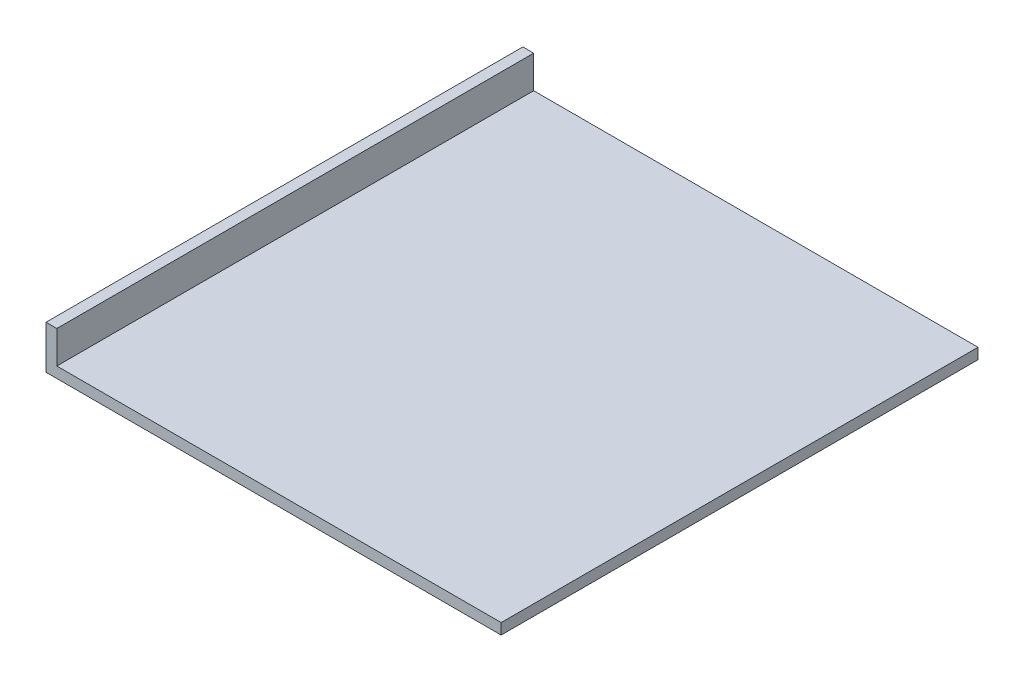
ISO-10303-21;
HEADER;
FILE_DESCRIPTION(('STEP AP214'),'2;1');
FILE_NAME('part.step','',(''),(''),'','','');
FILE_SCHEMA(('AUTOMOTIVE_DESIGN { 1 0 10303 214 1 1 1 1 }'));
ENDSEC;
DATA;
#1=APPLICATION_CONTEXT('core data for automotive mechanical design processes');
#2=APPLICATION_PROTOCOL_DEFINITION('international standard','automotive_design',2000,#1);
#3=PRODUCT_CONTEXT('',#1,'mechanical');
#4=PRODUCT('Part','Part','',(#3));
#5=PRODUCT_RELATED_PRODUCT_CATEGORY('part','',(#4));
#6=PRODUCT_DEFINITION_FORMATION('','',#4);
#7=PRODUCT_DEFINITION_CONTEXT('part definition',#1,'design');
#8=PRODUCT_DEFINITION('design','',#6,#7);
#9=PRODUCT_DEFINITION_SHAPE('','',#8);
#10=(LENGTH_UNIT() NAMED_UNIT(*) SI_UNIT(.MILLI.,.METRE.));
#11=(NAMED_UNIT(*) PLANE_ANGLE_UNIT() SI_UNIT($,.RADIAN.));
#12=(NAMED_UNIT(*) SI_UNIT($,.STERADIAN.) SOLID_ANGLE_UNIT());
#13=UNCERTAINTY_MEASURE_WITH_UNIT(LENGTH_MEASURE(1.E-05),#10,'distance_accuracy_value','');
#14=(GEOMETRIC_REPRESENTATION_CONTEXT(3) GLOBAL_UNCERTAINTY_ASSIGNED_CONTEXT((#13)) GLOBAL_UNIT_ASSIGNED_CONTEXT((#10,
#11,#12)) REPRESENTATION_CONTEXT('',''));
#15=CARTESIAN_POINT('',(0.,0.,0.));
#16=DIRECTION('',(0.,0.,1.));
#17=DIRECTION('',(1.,0.,0.));
#18=AXIS2_PLACEMENT_3D('',#15,#16,#17);
#19=CARTESIAN_POINT('',(0.,5.,0.));
#20=DIRECTION('',(0.,-1.,0.));
#21=DIRECTION('',(0.,0.,-1.));
#22=AXIS2_PLACEMENT_3D('',#19,#20,#21);
#23=PLANE('',#22);
#24=DIRECTION('',(0.,0.,-1.));
#25=VECTOR('',#24,1.);
#26=CARTESIAN_POINT('',(-100.,5.,-110.));
#27=LINE('',#26,#25);
#28=CARTESIAN_POINT('',(-100.,5.,110.));
#29=VERTEX_POINT('',#28);
#30=CARTESIAN_POINT('',(-100.,5.,-110.));
#31=VERTEX_POINT('',#30);
#32=EDGE_CURVE('E51',#29,#31,#27,.T.);
#33=ORIENTED_EDGE('',*,*,#32,.F.);
#34=DIRECTION('',(1.,0.,0.));
#35=VECTOR('',#34,1.);
#36=CARTESIAN_POINT('',(-105.,5.,110.));
#37=LINE('',#36,#35);
#38=CARTESIAN_POINT('',(105.,5.,110.));
#39=VERTEX_POINT('',#38);
#40=EDGE_CURVE('E56',#29,#39,#37,.T.);
#41=ORIENTED_EDGE('',*,*,#40,.T.);
#42=DIRECTION('',(0.,0.,-1.));
#43=VECTOR('',#42,1.);
#44=CARTESIAN_POINT('',(105.,5.,110.));
#45=LINE('',#44,#43);
#46=CARTESIAN_POINT('',(105.,5.,-110.));
#47=VERTEX_POINT('',#46);
#48=EDGE_CURVE('E87',#39,#47,#45,.T.);
#49=ORIENTED_EDGE('',*,*,#48,.T.);
#50=DIRECTION('',(-1.,0.,0.));
#51=VECTOR('',#50,1.);
#52=CARTESIAN_POINT('',(-105.,5.,-110.));
#53=LINE('',#52,#51);
#54=EDGE_CURVE('E137',#47,#31,#53,.T.);
#55=ORIENTED_EDGE('',*,*,#54,.T.);
#56=EDGE_LOOP('',(#33,#41,#49,#55));
#57=FACE_BOUND('',#56,.T.);
#58=ADVANCED_FACE('F36',(#57),#23,.F.);
#59=CARTESIAN_POINT('',(105.,5.,110.));
#60=DIRECTION('',(-1.,0.,0.));
#61=DIRECTION('',(0.,0.,1.));
#62=AXIS2_PLACEMENT_3D('',#59,#60,#61);
#63=PLANE('',#62);
#64=DIRECTION('',(0.,0.,-1.));
#65=VECTOR('',#64,1.);
#66=CARTESIAN_POINT('',(105.,0.,110.));
#67=LINE('',#66,#65);
#68=CARTESIAN_POINT('',(105.,0.,110.));
#69=VERTEX_POINT('',#68);
#70=CARTESIAN_POINT('',(105.,0.,-110.));
#71=VERTEX_POINT('',#70);
#72=EDGE_CURVE('E93',#69,#71,#67,.T.);
#73=ORIENTED_EDGE('',*,*,#72,.T.);
#74=DIRECTION('',(0.,-1.,0.));
#75=VECTOR('',#74,1.);
#76=CARTESIAN_POINT('',(105.,5.,-110.));
#77=LINE('',#76,#75);
#78=EDGE_CURVE('E11',#47,#71,#77,.T.);
#79=ORIENTED_EDGE('',*,*,#78,.F.);
#80=ORIENTED_EDGE('',*,*,#48,.F.);
#81=DIRECTION('',(0.,-1.,0.));
#82=VECTOR('',#81,1.);
#83=CARTESIAN_POINT('',(105.,5.,110.));
#84=LINE('',#83,#82);
#85=EDGE_CURVE('E79',#39,#69,#84,.T.);
#86=ORIENTED_EDGE('',*,*,#85,.T.);
#87=EDGE_LOOP('',(#73,#79,#80,#86));
#88=FACE_BOUND('',#87,.T.);
#89=ADVANCED_FACE('F38',(#88),#63,.F.);
#90=CARTESIAN_POINT('',(-105.,5.,-110.));
#91=DIRECTION('',(0.,0.,1.));
#92=DIRECTION('',(1.,0.,0.));
#93=AXIS2_PLACEMENT_3D('',#90,#91,#92);
#94=PLANE('',#93);
#95=DIRECTION('',(-1.,0.,0.));
#96=VECTOR('',#95,1.);
#97=CARTESIAN_POINT('',(-105.,0.,-110.));
#98=LINE('',#97,#96);
#99=CARTESIAN_POINT('',(-105.,0.,-110.));
#100=VERTEX_POINT('',#99);
#101=EDGE_CURVE('E96',#71,#100,#98,.T.);
#102=ORIENTED_EDGE('',*,*,#101,.T.);
#103=DIRECTION('',(0.,-1.,0.));
#104=VECTOR('',#103,1.);
#105=CARTESIAN_POINT('',(-105.,5.,-110.));
#106=LINE('',#105,#104);
#107=CARTESIAN_POINT('',(-105.,20.,-110.));
#108=VERTEX_POINT('',#107);
#109=EDGE_CURVE('E44',#108,#100,#106,.T.);
#110=ORIENTED_EDGE('',*,*,#109,.F.);
#111=DIRECTION('',(-1.,0.,0.));
#112=VECTOR('',#111,1.);
#113=CARTESIAN_POINT('',(-105.,20.,-110.));
#114=LINE('',#113,#112);
#115=CARTESIAN_POINT('',(-100.,20.,-110.));
#116=VERTEX_POINT('',#115);
#117=EDGE_CURVE('E120',#116,#108,#114,.T.);
#118=ORIENTED_EDGE('',*,*,#117,.F.);
#119=DIRECTION('',(0.,-1.,0.));
#120=VECTOR('',#119,1.);
#121=CARTESIAN_POINT('',(-100.,20.,-110.));
#122=LINE('',#121,#120);
#123=EDGE_CURVE('E101',#116,#31,#122,.T.);
#124=ORIENTED_EDGE('',*,*,#123,.T.);
#125=ORIENTED_EDGE('',*,*,#54,.F.);
#126=ORIENTED_EDGE('',*,*,#78,.T.);
#127=EDGE_LOOP('',(#102,#110,#118,#124,#125,#126));
#128=FACE_BOUND('',#127,.T.);
#129=ADVANCED_FACE('F117',(#128),#94,.F.);
#130=CARTESIAN_POINT('',(-105.,5.,110.));
#131=DIRECTION('',(1.,0.,0.));
#132=DIRECTION('',(0.,0.,-1.));
#133=AXIS2_PLACEMENT_3D('',#130,#131,#132);
#134=PLANE('',#133);
#135=DIRECTION('',(0.,0.,1.));
#136=VECTOR('',#135,1.);
#137=CARTESIAN_POINT('',(-105.,0.,110.));
#138=LINE('',#137,#136);
#139=CARTESIAN_POINT('',(-105.,0.,110.));
#140=VERTEX_POINT('',#139);
#141=EDGE_CURVE('E88',#100,#140,#138,.T.);
#142=ORIENTED_EDGE('',*,*,#141,.T.);
#143=DIRECTION('',(0.,-1.,0.));
#144=VECTOR('',#143,1.);
#145=CARTESIAN_POINT('',(-105.,5.,110.));
#146=LINE('',#145,#144);
#147=CARTESIAN_POINT('',(-105.,20.,110.));
#148=VERTEX_POINT('',#147);
#149=EDGE_CURVE('E83',#148,#140,#146,.T.);
#150=ORIENTED_EDGE('',*,*,#149,.F.);
#151=DIRECTION('',(0.,0.,1.));
#152=VECTOR('',#151,1.);
#153=CARTESIAN_POINT('',(-105.,20.,-110.));
#154=LINE('',#153,#152);
#155=EDGE_CURVE('E113',#108,#148,#154,.T.);
#156=ORIENTED_EDGE('',*,*,#155,.F.);
#157=ORIENTED_EDGE('',*,*,#109,.T.);
#158=EDGE_LOOP('',(#142,#150,#156,#157));
#159=FACE_BOUND('',#158,.T.);
#160=ADVANCED_FACE('F111',(#159),#134,.F.);
#161=CARTESIAN_POINT('',(-105.,5.,110.));
#162=DIRECTION('',(0.,0.,-1.));
#163=DIRECTION('',(-1.,0.,0.));
#164=AXIS2_PLACEMENT_3D('',#161,#162,#163);
#165=PLANE('',#164);
#166=DIRECTION('',(1.,0.,0.));
#167=VECTOR('',#166,1.);
#168=CARTESIAN_POINT('',(-105.,0.,110.));
#169=LINE('',#168,#167);
#170=EDGE_CURVE('E76',#140,#69,#169,.T.);
#171=ORIENTED_EDGE('',*,*,#170,.T.);
#172=ORIENTED_EDGE('',*,*,#85,.F.);
#173=ORIENTED_EDGE('',*,*,#40,.F.);
#174=DIRECTION('',(0.,-1.,0.));
#175=VECTOR('',#174,1.);
#176=CARTESIAN_POINT('',(-99.9999999999999,20.,110.));
#177=LINE('',#176,#175);
#178=CARTESIAN_POINT('',(-99.9999999999999,20.,110.));
#179=VERTEX_POINT('',#178);
#180=EDGE_CURVE('E97',#179,#29,#177,.T.);
#181=ORIENTED_EDGE('',*,*,#180,.F.);
#182=DIRECTION('',(1.,0.,0.));
#183=VECTOR('',#182,1.);
#184=CARTESIAN_POINT('',(-105.,20.,110.));
#185=LINE('',#184,#183);
#186=EDGE_CURVE('E132',#148,#179,#185,.T.);
#187=ORIENTED_EDGE('',*,*,#186,.F.);
#188=ORIENTED_EDGE('',*,*,#149,.T.);
#189=EDGE_LOOP('',(#171,#172,#173,#181,#187,#188));
#190=FACE_BOUND('',#189,.T.);
#191=ADVANCED_FACE('F78',(#190),#165,.F.);
#192=CARTESIAN_POINT('',(0.,0.,0.));
#193=DIRECTION('',(0.,-1.,0.));
#194=DIRECTION('',(0.,0.,-1.));
#195=AXIS2_PLACEMENT_3D('',#192,#193,#194);
#196=PLANE('',#195);
#197=ORIENTED_EDGE('',*,*,#72,.F.);
#198=ORIENTED_EDGE('',*,*,#170,.F.);
#199=ORIENTED_EDGE('',*,*,#141,.F.);
#200=ORIENTED_EDGE('',*,*,#101,.F.);
#201=EDGE_LOOP('',(#197,#198,#199,#200));
#202=FACE_BOUND('',#201,.T.);
#203=ADVANCED_FACE('F95',(#202),#196,.T.);
#204=CARTESIAN_POINT('',(-100.,20.,-110.));
#205=DIRECTION('',(-1.,0.,0.));
#206=DIRECTION('',(0.,0.,1.));
#207=AXIS2_PLACEMENT_3D('',#204,#205,#206);
#208=PLANE('',#207);
#209=ORIENTED_EDGE('',*,*,#32,.T.);
#210=ORIENTED_EDGE('',*,*,#123,.F.);
#211=DIRECTION('',(0.,0.,-1.));
#212=VECTOR('',#211,1.);
#213=CARTESIAN_POINT('',(-100.,20.,-110.));
#214=LINE('',#213,#212);
#215=EDGE_CURVE('E128',#179,#116,#214,.T.);
#216=ORIENTED_EDGE('',*,*,#215,.F.);
#217=ORIENTED_EDGE('',*,*,#180,.T.);
#218=EDGE_LOOP('',(#209,#210,#216,#217));
#219=FACE_BOUND('',#218,.T.);
#220=ADVANCED_FACE('F140',(#219),#208,.F.);
#221=CARTESIAN_POINT('',(0.,20.,0.));
#222=DIRECTION('',(0.,1.,0.));
#223=DIRECTION('',(0.,0.,1.));
#224=AXIS2_PLACEMENT_3D('',#221,#222,#223);
#225=PLANE('',#224);
#226=ORIENTED_EDGE('',*,*,#155,.T.);
#227=ORIENTED_EDGE('',*,*,#186,.T.);
#228=ORIENTED_EDGE('',*,*,#215,.T.);
#229=ORIENTED_EDGE('',*,*,#117,.T.);
#230=EDGE_LOOP('',(#226,#227,#228,#229));
#231=FACE_BOUND('',#230,.T.);
#232=ADVANCED_FACE('F124',(#231),#225,.T.);
#233=CLOSED_SHELL('',(#58,#89,#129,#160,#191,#203,#220,#232));
#234=MANIFOLD_SOLID_BREP('B2',#233);
#235=ADVANCED_BREP_SHAPE_REPRESENTATION('',(#18,#234),#14);
#236=SHAPE_DEFINITION_REPRESENTATION(#9,#235);
ENDSEC;
END-ISO-10303-21;
